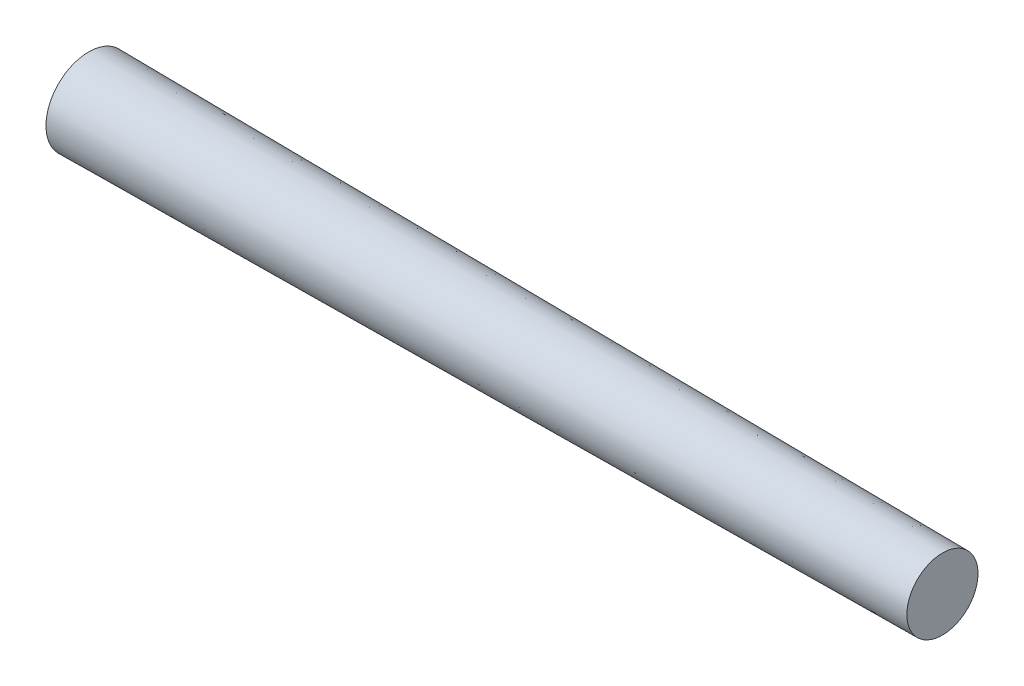
ISO-10303-21;
HEADER;
FILE_DESCRIPTION(('STEP AP214'),'2;1');
FILE_NAME('part.step','',(''),(''),'','','');
FILE_SCHEMA(('AUTOMOTIVE_DESIGN { 1 0 10303 214 1 1 1 1 }'));
ENDSEC;
DATA;
#1=APPLICATION_CONTEXT('core data for automotive mechanical design processes');
#2=APPLICATION_PROTOCOL_DEFINITION('international standard','automotive_design',2000,#1);
#3=PRODUCT_CONTEXT('',#1,'mechanical');
#4=PRODUCT('Part','Part','',(#3));
#5=PRODUCT_RELATED_PRODUCT_CATEGORY('part','',(#4));
#6=PRODUCT_DEFINITION_FORMATION('','',#4);
#7=PRODUCT_DEFINITION_CONTEXT('part definition',#1,'design');
#8=PRODUCT_DEFINITION('design','',#6,#7);
#9=PRODUCT_DEFINITION_SHAPE('','',#8);
#10=(LENGTH_UNIT() NAMED_UNIT(*) SI_UNIT(.MILLI.,.METRE.));
#11=(NAMED_UNIT(*) PLANE_ANGLE_UNIT() SI_UNIT($,.RADIAN.));
#12=(NAMED_UNIT(*) SI_UNIT($,.STERADIAN.) SOLID_ANGLE_UNIT());
#13=UNCERTAINTY_MEASURE_WITH_UNIT(LENGTH_MEASURE(1.E-05),#10,'distance_accuracy_value','');
#14=(GEOMETRIC_REPRESENTATION_CONTEXT(3) GLOBAL_UNCERTAINTY_ASSIGNED_CONTEXT((#13)) GLOBAL_UNIT_ASSIGNED_CONTEXT((#10,
#11,#12)) REPRESENTATION_CONTEXT('',''));
#15=CARTESIAN_POINT('',(0.,0.,0.));
#16=DIRECTION('',(0.,0.,1.));
#17=DIRECTION('',(1.,0.,0.));
#18=AXIS2_PLACEMENT_3D('',#15,#16,#17);
#19=CARTESIAN_POINT('',(-16.2857142857143,0.,0.));
#20=DIRECTION('',(-1.,0.,0.));
#21=DIRECTION('',(0.,-1.,0.));
#22=AXIS2_PLACEMENT_3D('',#19,#20,#21);
#23=PLANE('',#22);
#24=CARTESIAN_POINT('',(-16.2857142857143,0.,0.));
#25=DIRECTION('',(1.,0.,0.));
#26=DIRECTION('',(0.,1.,0.));
#27=AXIS2_PLACEMENT_3D('',#24,#25,#26);
#28=CIRCLE('',#27,3.);
#29=CARTESIAN_POINT('',(-16.2857142857143,3.,0.));
#30=VERTEX_POINT('',#29);
#31=EDGE_CURVE('E10',#30,#30,#28,.T.);
#32=ORIENTED_EDGE('',*,*,#31,.F.);
#33=EDGE_LOOP('',(#32));
#34=FACE_BOUND('',#33,.T.);
#35=ADVANCED_FACE('F34',(#34),#23,.T.);
#36=CARTESIAN_POINT('',(43.7142857142857,0.,0.));
#37=DIRECTION('',(-1.,0.,0.));
#38=DIRECTION('',(0.,-1.,0.));
#39=AXIS2_PLACEMENT_3D('',#36,#37,#38);
#40=CONICAL_SURFACE('',#39,2.5,0.00833314044013592);
#41=ORIENTED_EDGE('',*,*,#31,.T.);
#42=EDGE_LOOP('',(#41));
#43=FACE_BOUND('',#42,.T.);
#44=CARTESIAN_POINT('',(43.7142857142857,0.,0.));
#45=DIRECTION('',(1.,0.,0.));
#46=DIRECTION('',(0.,1.,0.));
#47=AXIS2_PLACEMENT_3D('',#44,#45,#46);
#48=CIRCLE('',#47,2.5);
#49=CARTESIAN_POINT('',(43.7142857142857,2.5,0.));
#50=VERTEX_POINT('',#49);
#51=EDGE_CURVE('E40',#50,#50,#48,.T.);
#52=ORIENTED_EDGE('',*,*,#51,.F.);
#53=EDGE_LOOP('',(#52));
#54=FACE_BOUND('',#53,.T.);
#55=ADVANCED_FACE('F48',(#43,#54),#40,.T.);
#56=CARTESIAN_POINT('',(43.7142857142857,2.5,0.));
#57=DIRECTION('',(1.,0.,0.));
#58=DIRECTION('',(0.,1.,0.));
#59=AXIS2_PLACEMENT_3D('',#56,#57,#58);
#60=PLANE('',#59);
#61=ORIENTED_EDGE('',*,*,#51,.T.);
#62=EDGE_LOOP('',(#61));
#63=FACE_BOUND('',#62,.T.);
#64=ADVANCED_FACE('F46',(#63),#60,.T.);
#65=CLOSED_SHELL('',(#35,#55,#64));
#66=MANIFOLD_SOLID_BREP('B2',#65);
#67=ADVANCED_BREP_SHAPE_REPRESENTATION('',(#18,#66),#14);
#68=SHAPE_DEFINITION_REPRESENTATION(#9,#67);
ENDSEC;
END-ISO-10303-21;
